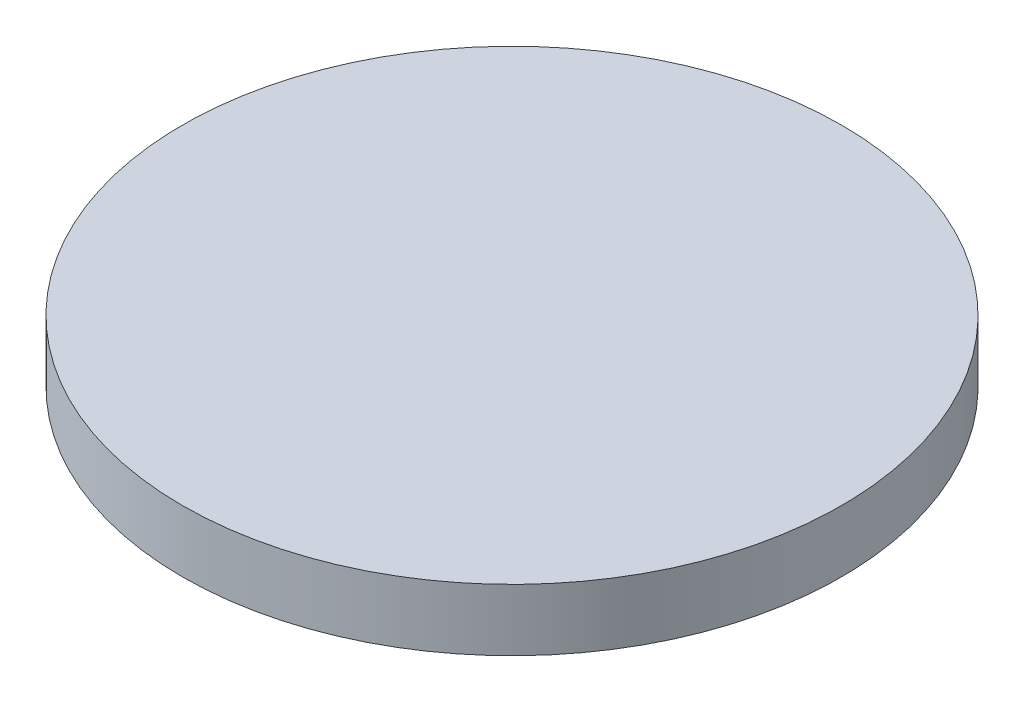
ISO-10303-21;
HEADER;
FILE_DESCRIPTION(('STEP AP214'),'2;1');
FILE_NAME('part.step','',(''),(''),'','','');
FILE_SCHEMA(('AUTOMOTIVE_DESIGN { 1 0 10303 214 1 1 1 1 }'));
ENDSEC;
DATA;
#1=APPLICATION_CONTEXT('core data for automotive mechanical design processes');
#2=APPLICATION_PROTOCOL_DEFINITION('international standard','automotive_design',2000,#1);
#3=PRODUCT_CONTEXT('',#1,'mechanical');
#4=PRODUCT('Part','Part','',(#3));
#5=PRODUCT_RELATED_PRODUCT_CATEGORY('part','',(#4));
#6=PRODUCT_DEFINITION_FORMATION('','',#4);
#7=PRODUCT_DEFINITION_CONTEXT('part definition',#1,'design');
#8=PRODUCT_DEFINITION('design','',#6,#7);
#9=PRODUCT_DEFINITION_SHAPE('','',#8);
#10=(LENGTH_UNIT() NAMED_UNIT(*) SI_UNIT(.MILLI.,.METRE.));
#11=(NAMED_UNIT(*) PLANE_ANGLE_UNIT() SI_UNIT($,.RADIAN.));
#12=(NAMED_UNIT(*) SI_UNIT($,.STERADIAN.) SOLID_ANGLE_UNIT());
#13=UNCERTAINTY_MEASURE_WITH_UNIT(LENGTH_MEASURE(1.E-05),#10,'distance_accuracy_value','');
#14=(GEOMETRIC_REPRESENTATION_CONTEXT(3) GLOBAL_UNCERTAINTY_ASSIGNED_CONTEXT((#13)) GLOBAL_UNIT_ASSIGNED_CONTEXT((#10,
#11,#12)) REPRESENTATION_CONTEXT('',''));
#15=CARTESIAN_POINT('',(0.,0.,0.));
#16=DIRECTION('',(0.,0.,1.));
#17=DIRECTION('',(1.,0.,0.));
#18=AXIS2_PLACEMENT_3D('',#15,#16,#17);
#19=CARTESIAN_POINT('',(0.,3.,0.));
#20=DIRECTION('',(0.,-1.,0.));
#21=DIRECTION('',(0.,0.,-1.));
#22=AXIS2_PLACEMENT_3D('',#19,#20,#21);
#23=CYLINDRICAL_SURFACE('',#22,16.);
#24=CARTESIAN_POINT('',(0.,3.,0.));
#25=DIRECTION('',(0.,1.,0.));
#26=DIRECTION('',(0.,0.,1.));
#27=AXIS2_PLACEMENT_3D('',#24,#25,#26);
#28=CIRCLE('',#27,16.);
#29=CARTESIAN_POINT('',(0.,3.,16.));
#30=VERTEX_POINT('',#29);
#31=EDGE_CURVE('E11',#30,#30,#28,.T.);
#32=ORIENTED_EDGE('',*,*,#31,.F.);
#33=EDGE_LOOP('',(#32));
#34=FACE_BOUND('',#33,.T.);
#35=CARTESIAN_POINT('',(0.,0.,0.));
#36=DIRECTION('',(0.,1.,0.));
#37=DIRECTION('',(0.,0.,1.));
#38=AXIS2_PLACEMENT_3D('',#35,#36,#37);
#39=CIRCLE('',#38,16.);
#40=CARTESIAN_POINT('',(0.,0.,16.));
#41=VERTEX_POINT('',#40);
#42=EDGE_CURVE('E46',#41,#41,#39,.T.);
#43=ORIENTED_EDGE('',*,*,#42,.T.);
#44=EDGE_LOOP('',(#43));
#45=FACE_BOUND('',#44,.T.);
#46=ADVANCED_FACE('F43',(#34,#45),#23,.T.);
#47=CARTESIAN_POINT('',(0.,0.,0.));
#48=DIRECTION('',(0.,1.,0.));
#49=DIRECTION('',(0.,0.,1.));
#50=AXIS2_PLACEMENT_3D('',#47,#48,#49);
#51=PLANE('',#50);
#52=ORIENTED_EDGE('',*,*,#42,.F.);
#53=EDGE_LOOP('',(#52));
#54=FACE_BOUND('',#53,.T.);
#55=ADVANCED_FACE('F56',(#54),#51,.F.);
#56=CARTESIAN_POINT('',(0.,3.,0.));
#57=DIRECTION('',(0.,1.,0.));
#58=DIRECTION('',(0.,0.,1.));
#59=AXIS2_PLACEMENT_3D('',#56,#57,#58);
#60=PLANE('',#59);
#61=ORIENTED_EDGE('',*,*,#31,.T.);
#62=EDGE_LOOP('',(#61));
#63=FACE_BOUND('',#62,.T.);
#64=ADVANCED_FACE('F58',(#63),#60,.T.);
#65=CLOSED_SHELL('',(#46,#55,#64));
#66=MANIFOLD_SOLID_BREP('B2',#65);
#67=ADVANCED_BREP_SHAPE_REPRESENTATION('',(#18,#66),#14);
#68=SHAPE_DEFINITION_REPRESENTATION(#9,#67);
ENDSEC;
END-ISO-10303-21;
